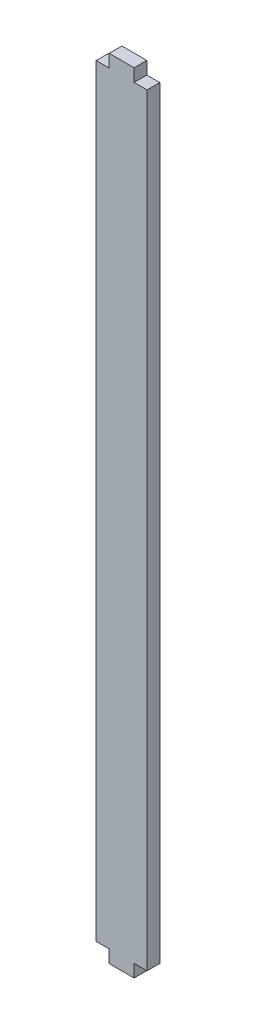
ISO-10303-21;
HEADER;
FILE_DESCRIPTION(('STEP AP214'),'2;1');
FILE_NAME('part.step','',(''),(''),'','','');
FILE_SCHEMA(('AUTOMOTIVE_DESIGN { 1 0 10303 214 1 1 1 1 }'));
ENDSEC;
DATA;
#1=APPLICATION_CONTEXT('core data for automotive mechanical design processes');
#2=APPLICATION_PROTOCOL_DEFINITION('international standard','automotive_design',2000,#1);
#3=PRODUCT_CONTEXT('',#1,'mechanical');
#4=PRODUCT('Part','Part','',(#3));
#5=PRODUCT_RELATED_PRODUCT_CATEGORY('part','',(#4));
#6=PRODUCT_DEFINITION_FORMATION('','',#4);
#7=PRODUCT_DEFINITION_CONTEXT('part definition',#1,'design');
#8=PRODUCT_DEFINITION('design','',#6,#7);
#9=PRODUCT_DEFINITION_SHAPE('','',#8);
#10=(LENGTH_UNIT() NAMED_UNIT(*) SI_UNIT(.MILLI.,.METRE.));
#11=(NAMED_UNIT(*) PLANE_ANGLE_UNIT() SI_UNIT($,.RADIAN.));
#12=(NAMED_UNIT(*) SI_UNIT($,.STERADIAN.) SOLID_ANGLE_UNIT());
#13=UNCERTAINTY_MEASURE_WITH_UNIT(LENGTH_MEASURE(1.E-05),#10,'distance_accuracy_value','');
#14=(GEOMETRIC_REPRESENTATION_CONTEXT(3) GLOBAL_UNCERTAINTY_ASSIGNED_CONTEXT((#13)) GLOBAL_UNIT_ASSIGNED_CONTEXT((#10,
#11,#12)) REPRESENTATION_CONTEXT('',''));
#15=CARTESIAN_POINT('',(0.,0.,0.));
#16=DIRECTION('',(0.,0.,1.));
#17=DIRECTION('',(1.,0.,0.));
#18=AXIS2_PLACEMENT_3D('',#15,#16,#17);
#19=CARTESIAN_POINT('',(112.4,-5.,69.9));
#20=DIRECTION('',(-1.,0.,0.));
#21=DIRECTION('',(0.,0.,1.));
#22=AXIS2_PLACEMENT_3D('',#19,#20,#21);
#23=PLANE('',#22);
#24=DIRECTION('',(0.,1.,0.));
#25=VECTOR('',#24,1.);
#26=CARTESIAN_POINT('',(112.4,-5.,64.9));
#27=LINE('',#26,#25);
#28=CARTESIAN_POINT('',(112.4,-5.,64.9));
#29=VERTEX_POINT('',#28);
#30=CARTESIAN_POINT('',(112.4,0.,64.9));
#31=VERTEX_POINT('',#30);
#32=EDGE_CURVE('E157',#29,#31,#27,.T.);
#33=ORIENTED_EDGE('',*,*,#32,.T.);
#34=DIRECTION('',(0.,0.,-1.));
#35=VECTOR('',#34,1.);
#36=CARTESIAN_POINT('',(112.4,0.,69.9));
#37=LINE('',#36,#35);
#38=CARTESIAN_POINT('',(112.4,0.,69.9));
#39=VERTEX_POINT('',#38);
#40=EDGE_CURVE('E11',#39,#31,#37,.T.);
#41=ORIENTED_EDGE('',*,*,#40,.F.);
#42=DIRECTION('',(0.,1.,0.));
#43=VECTOR('',#42,1.);
#44=CARTESIAN_POINT('',(112.4,-5.,69.9));
#45=LINE('',#44,#43);
#46=CARTESIAN_POINT('',(112.4,-5.,69.9));
#47=VERTEX_POINT('',#46);
#48=EDGE_CURVE('E180',#47,#39,#45,.T.);
#49=ORIENTED_EDGE('',*,*,#48,.F.);
#50=DIRECTION('',(0.,0.,-1.));
#51=VECTOR('',#50,1.);
#52=CARTESIAN_POINT('',(112.4,-5.,69.9));
#53=LINE('',#52,#51);
#54=EDGE_CURVE('E153',#47,#29,#53,.T.);
#55=ORIENTED_EDGE('',*,*,#54,.T.);
#56=EDGE_LOOP('',(#33,#41,#49,#55));
#57=FACE_BOUND('',#56,.T.);
#58=ADVANCED_FACE('F37',(#57),#23,.F.);
#59=CARTESIAN_POINT('',(112.4,0.,69.9));
#60=DIRECTION('',(0.,-1.,0.));
#61=DIRECTION('',(0.,0.,-1.));
#62=AXIS2_PLACEMENT_3D('',#59,#60,#61);
#63=PLANE('',#62);
#64=DIRECTION('',(-1.,0.,0.));
#65=VECTOR('',#64,1.);
#66=CARTESIAN_POINT('',(112.4,0.,64.9));
#67=LINE('',#66,#65);
#68=CARTESIAN_POINT('',(102.6,0.,64.9));
#69=VERTEX_POINT('',#68);
#70=EDGE_CURVE('E160',#31,#69,#67,.T.);
#71=ORIENTED_EDGE('',*,*,#70,.T.);
#72=DIRECTION('',(0.,0.,-1.));
#73=VECTOR('',#72,1.);
#74=CARTESIAN_POINT('',(102.6,0.,69.9));
#75=LINE('',#74,#73);
#76=CARTESIAN_POINT('',(102.6,0.,69.9));
#77=VERTEX_POINT('',#76);
#78=EDGE_CURVE('E45',#77,#69,#75,.T.);
#79=ORIENTED_EDGE('',*,*,#78,.F.);
#80=DIRECTION('',(-1.,0.,0.));
#81=VECTOR('',#80,1.);
#82=CARTESIAN_POINT('',(112.4,0.,69.9));
#83=LINE('',#82,#81);
#84=EDGE_CURVE('E108',#39,#77,#83,.T.);
#85=ORIENTED_EDGE('',*,*,#84,.F.);
#86=ORIENTED_EDGE('',*,*,#40,.T.);
#87=EDGE_LOOP('',(#71,#79,#85,#86));
#88=FACE_BOUND('',#87,.T.);
#89=ADVANCED_FACE('F259',(#88),#63,.F.);
#90=CARTESIAN_POINT('',(102.6,0.,69.9));
#91=DIRECTION('',(1.,0.,0.));
#92=DIRECTION('',(0.,0.,-1.));
#93=AXIS2_PLACEMENT_3D('',#90,#91,#92);
#94=PLANE('',#93);
#95=DIRECTION('',(0.,-1.,0.));
#96=VECTOR('',#95,1.);
#97=CARTESIAN_POINT('',(102.6,0.,64.9));
#98=LINE('',#97,#96);
#99=CARTESIAN_POINT('',(102.6,-5.,64.9));
#100=VERTEX_POINT('',#99);
#101=EDGE_CURVE('E162',#69,#100,#98,.T.);
#102=ORIENTED_EDGE('',*,*,#101,.T.);
#103=DIRECTION('',(0.,0.,-1.));
#104=VECTOR('',#103,1.);
#105=CARTESIAN_POINT('',(102.6,-5.,69.9));
#106=LINE('',#105,#104);
#107=CARTESIAN_POINT('',(102.6,-5.,69.9));
#108=VERTEX_POINT('',#107);
#109=EDGE_CURVE('E199',#108,#100,#106,.T.);
#110=ORIENTED_EDGE('',*,*,#109,.F.);
#111=DIRECTION('',(0.,-1.,0.));
#112=VECTOR('',#111,1.);
#113=CARTESIAN_POINT('',(102.6,0.,69.9));
#114=LINE('',#113,#112);
#115=EDGE_CURVE('E207',#77,#108,#114,.T.);
#116=ORIENTED_EDGE('',*,*,#115,.F.);
#117=ORIENTED_EDGE('',*,*,#78,.T.);
#118=EDGE_LOOP('',(#102,#110,#116,#117));
#119=FACE_BOUND('',#118,.T.);
#120=ADVANCED_FACE('F205',(#119),#94,.F.);
#121=CARTESIAN_POINT('',(102.6,-5.,69.9));
#122=DIRECTION('',(0.,-1.,0.));
#123=DIRECTION('',(0.,0.,-1.));
#124=AXIS2_PLACEMENT_3D('',#121,#122,#123);
#125=PLANE('',#124);
#126=DIRECTION('',(-1.,0.,0.));
#127=VECTOR('',#126,1.);
#128=CARTESIAN_POINT('',(102.6,-5.,64.9));
#129=LINE('',#128,#127);
#130=CARTESIAN_POINT('',(97.5,-5.,64.9));
#131=VERTEX_POINT('',#130);
#132=EDGE_CURVE('E164',#100,#131,#129,.T.);
#133=ORIENTED_EDGE('',*,*,#132,.T.);
#134=DIRECTION('',(0.,0.,-1.));
#135=VECTOR('',#134,1.);
#136=CARTESIAN_POINT('',(97.5,-5.,69.9));
#137=LINE('',#136,#135);
#138=CARTESIAN_POINT('',(97.5,-5.,69.9));
#139=VERTEX_POINT('',#138);
#140=EDGE_CURVE('E196',#139,#131,#137,.T.);
#141=ORIENTED_EDGE('',*,*,#140,.F.);
#142=DIRECTION('',(-1.,0.,0.));
#143=VECTOR('',#142,1.);
#144=CARTESIAN_POINT('',(102.6,-5.,69.9));
#145=LINE('',#144,#143);
#146=EDGE_CURVE('E226',#108,#139,#145,.T.);
#147=ORIENTED_EDGE('',*,*,#146,.F.);
#148=ORIENTED_EDGE('',*,*,#109,.T.);
#149=EDGE_LOOP('',(#133,#141,#147,#148));
#150=FACE_BOUND('',#149,.T.);
#151=ADVANCED_FACE('F216',(#150),#125,.F.);
#152=CARTESIAN_POINT('',(97.5,-5.,69.9));
#153=DIRECTION('',(1.,0.,0.));
#154=DIRECTION('',(0.,0.,-1.));
#155=AXIS2_PLACEMENT_3D('',#152,#153,#154);
#156=PLANE('',#155);
#157=DIRECTION('',(0.,-1.,0.));
#158=VECTOR('',#157,1.);
#159=CARTESIAN_POINT('',(97.5,-5.,64.9));
#160=LINE('',#159,#158);
#161=CARTESIAN_POINT('',(97.5,-305.,64.9));
#162=VERTEX_POINT('',#161);
#163=EDGE_CURVE('E166',#131,#162,#160,.T.);
#164=ORIENTED_EDGE('',*,*,#163,.T.);
#165=DIRECTION('',(0.,0.,-1.));
#166=VECTOR('',#165,1.);
#167=CARTESIAN_POINT('',(97.5,-305.,69.9));
#168=LINE('',#167,#166);
#169=CARTESIAN_POINT('',(97.5,-305.,69.9));
#170=VERTEX_POINT('',#169);
#171=EDGE_CURVE('E193',#170,#162,#168,.T.);
#172=ORIENTED_EDGE('',*,*,#171,.F.);
#173=DIRECTION('',(0.,-1.,0.));
#174=VECTOR('',#173,1.);
#175=CARTESIAN_POINT('',(97.5,-5.,69.9));
#176=LINE('',#175,#174);
#177=EDGE_CURVE('E222',#139,#170,#176,.T.);
#178=ORIENTED_EDGE('',*,*,#177,.F.);
#179=ORIENTED_EDGE('',*,*,#140,.T.);
#180=EDGE_LOOP('',(#164,#172,#178,#179));
#181=FACE_BOUND('',#180,.T.);
#182=ADVANCED_FACE('F220',(#181),#156,.F.);
#183=CARTESIAN_POINT('',(97.5,-305.,69.9));
#184=DIRECTION('',(0.,1.,0.));
#185=DIRECTION('',(0.,0.,1.));
#186=AXIS2_PLACEMENT_3D('',#183,#184,#185);
#187=PLANE('',#186);
#188=DIRECTION('',(1.,0.,0.));
#189=VECTOR('',#188,1.);
#190=CARTESIAN_POINT('',(97.5,-305.,64.9));
#191=LINE('',#190,#189);
#192=CARTESIAN_POINT('',(102.6,-305.,64.9));
#193=VERTEX_POINT('',#192);
#194=EDGE_CURVE('E169',#162,#193,#191,.T.);
#195=ORIENTED_EDGE('',*,*,#194,.T.);
#196=DIRECTION('',(0.,0.,-1.));
#197=VECTOR('',#196,1.);
#198=CARTESIAN_POINT('',(102.6,-305.,69.9));
#199=LINE('',#198,#197);
#200=CARTESIAN_POINT('',(102.6,-305.,69.9));
#201=VERTEX_POINT('',#200);
#202=EDGE_CURVE('E190',#201,#193,#199,.T.);
#203=ORIENTED_EDGE('',*,*,#202,.F.);
#204=DIRECTION('',(1.,0.,0.));
#205=VECTOR('',#204,1.);
#206=CARTESIAN_POINT('',(97.5,-305.,69.9));
#207=LINE('',#206,#205);
#208=EDGE_CURVE('E225',#170,#201,#207,.T.);
#209=ORIENTED_EDGE('',*,*,#208,.F.);
#210=ORIENTED_EDGE('',*,*,#171,.T.);
#211=EDGE_LOOP('',(#195,#203,#209,#210));
#212=FACE_BOUND('',#211,.T.);
#213=ADVANCED_FACE('F272',(#212),#187,.F.);
#214=CARTESIAN_POINT('',(102.6,-305.,69.9));
#215=DIRECTION('',(1.,0.,0.));
#216=DIRECTION('',(0.,0.,-1.));
#217=AXIS2_PLACEMENT_3D('',#214,#215,#216);
#218=PLANE('',#217);
#219=DIRECTION('',(0.,-1.,0.));
#220=VECTOR('',#219,1.);
#221=CARTESIAN_POINT('',(102.6,-305.,64.9));
#222=LINE('',#221,#220);
#223=CARTESIAN_POINT('',(102.6,-310.,64.9));
#224=VERTEX_POINT('',#223);
#225=EDGE_CURVE('E171',#193,#224,#222,.T.);
#226=ORIENTED_EDGE('',*,*,#225,.T.);
#227=DIRECTION('',(0.,0.,-1.));
#228=VECTOR('',#227,1.);
#229=CARTESIAN_POINT('',(102.6,-310.,69.9));
#230=LINE('',#229,#228);
#231=CARTESIAN_POINT('',(102.6,-310.,69.9));
#232=VERTEX_POINT('',#231);
#233=EDGE_CURVE('E187',#232,#224,#230,.T.);
#234=ORIENTED_EDGE('',*,*,#233,.F.);
#235=DIRECTION('',(0.,-1.,0.));
#236=VECTOR('',#235,1.);
#237=CARTESIAN_POINT('',(102.6,-305.,69.9));
#238=LINE('',#237,#236);
#239=EDGE_CURVE('E228',#201,#232,#238,.T.);
#240=ORIENTED_EDGE('',*,*,#239,.F.);
#241=ORIENTED_EDGE('',*,*,#202,.T.);
#242=EDGE_LOOP('',(#226,#234,#240,#241));
#243=FACE_BOUND('',#242,.T.);
#244=ADVANCED_FACE('F275',(#243),#218,.F.);
#245=CARTESIAN_POINT('',(102.6,-310.,69.9));
#246=DIRECTION('',(0.,1.,0.));
#247=DIRECTION('',(0.,0.,1.));
#248=AXIS2_PLACEMENT_3D('',#245,#246,#247);
#249=PLANE('',#248);
#250=DIRECTION('',(1.,0.,0.));
#251=VECTOR('',#250,1.);
#252=CARTESIAN_POINT('',(102.6,-310.,64.9));
#253=LINE('',#252,#251);
#254=CARTESIAN_POINT('',(112.4,-310.,64.9));
#255=VERTEX_POINT('',#254);
#256=EDGE_CURVE('E173',#224,#255,#253,.T.);
#257=ORIENTED_EDGE('',*,*,#256,.T.);
#258=DIRECTION('',(0.,0.,-1.));
#259=VECTOR('',#258,1.);
#260=CARTESIAN_POINT('',(112.4,-310.,69.9));
#261=LINE('',#260,#259);
#262=CARTESIAN_POINT('',(112.4,-310.,69.9));
#263=VERTEX_POINT('',#262);
#264=EDGE_CURVE('E184',#263,#255,#261,.T.);
#265=ORIENTED_EDGE('',*,*,#264,.F.);
#266=DIRECTION('',(1.,0.,0.));
#267=VECTOR('',#266,1.);
#268=CARTESIAN_POINT('',(102.6,-310.,69.9));
#269=LINE('',#268,#267);
#270=EDGE_CURVE('E234',#232,#263,#269,.T.);
#271=ORIENTED_EDGE('',*,*,#270,.F.);
#272=ORIENTED_EDGE('',*,*,#233,.T.);
#273=EDGE_LOOP('',(#257,#265,#271,#272));
#274=FACE_BOUND('',#273,.T.);
#275=ADVANCED_FACE('F240',(#274),#249,.F.);
#276=CARTESIAN_POINT('',(112.4,-310.,69.9));
#277=DIRECTION('',(-1.,0.,0.));
#278=DIRECTION('',(0.,0.,1.));
#279=AXIS2_PLACEMENT_3D('',#276,#277,#278);
#280=PLANE('',#279);
#281=DIRECTION('',(0.,1.,0.));
#282=VECTOR('',#281,1.);
#283=CARTESIAN_POINT('',(112.4,-310.,64.9));
#284=LINE('',#283,#282);
#285=CARTESIAN_POINT('',(112.4,-305.,64.9));
#286=VERTEX_POINT('',#285);
#287=EDGE_CURVE('E175',#255,#286,#284,.T.);
#288=ORIENTED_EDGE('',*,*,#287,.T.);
#289=DIRECTION('',(0.,0.,-1.));
#290=VECTOR('',#289,1.);
#291=CARTESIAN_POINT('',(112.4,-305.,69.9));
#292=LINE('',#291,#290);
#293=CARTESIAN_POINT('',(112.4,-305.,69.9));
#294=VERTEX_POINT('',#293);
#295=EDGE_CURVE('E148',#294,#286,#292,.T.);
#296=ORIENTED_EDGE('',*,*,#295,.F.);
#297=DIRECTION('',(0.,1.,0.));
#298=VECTOR('',#297,1.);
#299=CARTESIAN_POINT('',(112.4,-310.,69.9));
#300=LINE('',#299,#298);
#301=EDGE_CURVE('E139',#263,#294,#300,.T.);
#302=ORIENTED_EDGE('',*,*,#301,.F.);
#303=ORIENTED_EDGE('',*,*,#264,.T.);
#304=EDGE_LOOP('',(#288,#296,#302,#303));
#305=FACE_BOUND('',#304,.T.);
#306=ADVANCED_FACE('F244',(#305),#280,.F.);
#307=CARTESIAN_POINT('',(112.4,-305.,69.9));
#308=DIRECTION('',(0.,1.,0.));
#309=DIRECTION('',(0.,0.,1.));
#310=AXIS2_PLACEMENT_3D('',#307,#308,#309);
#311=PLANE('',#310);
#312=DIRECTION('',(1.,0.,0.));
#313=VECTOR('',#312,1.);
#314=CARTESIAN_POINT('',(112.4,-305.,64.9));
#315=LINE('',#314,#313);
#316=CARTESIAN_POINT('',(117.5,-305.,64.9));
#317=VERTEX_POINT('',#316);
#318=EDGE_CURVE('E147',#286,#317,#315,.T.);
#319=ORIENTED_EDGE('',*,*,#318,.T.);
#320=DIRECTION('',(0.,0.,-1.));
#321=VECTOR('',#320,1.);
#322=CARTESIAN_POINT('',(117.5,-305.,69.9));
#323=LINE('',#322,#321);
#324=CARTESIAN_POINT('',(117.5,-305.,69.9));
#325=VERTEX_POINT('',#324);
#326=EDGE_CURVE('E144',#325,#317,#323,.T.);
#327=ORIENTED_EDGE('',*,*,#326,.F.);
#328=DIRECTION('',(1.,0.,0.));
#329=VECTOR('',#328,1.);
#330=CARTESIAN_POINT('',(112.4,-305.,69.9));
#331=LINE('',#330,#329);
#332=EDGE_CURVE('E133',#294,#325,#331,.T.);
#333=ORIENTED_EDGE('',*,*,#332,.F.);
#334=ORIENTED_EDGE('',*,*,#295,.T.);
#335=EDGE_LOOP('',(#319,#327,#333,#334));
#336=FACE_BOUND('',#335,.T.);
#337=ADVANCED_FACE('F145',(#336),#311,.F.);
#338=CARTESIAN_POINT('',(117.5,-305.,69.9));
#339=DIRECTION('',(-1.,0.,0.));
#340=DIRECTION('',(0.,0.,1.));
#341=AXIS2_PLACEMENT_3D('',#338,#339,#340);
#342=PLANE('',#341);
#343=DIRECTION('',(0.,1.,0.));
#344=VECTOR('',#343,1.);
#345=CARTESIAN_POINT('',(117.5,-305.,64.9));
#346=LINE('',#345,#344);
#347=CARTESIAN_POINT('',(117.5,-5.,64.9));
#348=VERTEX_POINT('',#347);
#349=EDGE_CURVE('E94',#317,#348,#346,.T.);
#350=ORIENTED_EDGE('',*,*,#349,.T.);
#351=DIRECTION('',(0.,0.,-1.));
#352=VECTOR('',#351,1.);
#353=CARTESIAN_POINT('',(117.5,-5.,69.9));
#354=LINE('',#353,#352);
#355=CARTESIAN_POINT('',(117.5,-5.,69.9));
#356=VERTEX_POINT('',#355);
#357=EDGE_CURVE('E149',#356,#348,#354,.T.);
#358=ORIENTED_EDGE('',*,*,#357,.F.);
#359=DIRECTION('',(0.,1.,0.));
#360=VECTOR('',#359,1.);
#361=CARTESIAN_POINT('',(117.5,-305.,69.9));
#362=LINE('',#361,#360);
#363=EDGE_CURVE('E137',#325,#356,#362,.T.);
#364=ORIENTED_EDGE('',*,*,#363,.F.);
#365=ORIENTED_EDGE('',*,*,#326,.T.);
#366=EDGE_LOOP('',(#350,#358,#364,#365));
#367=FACE_BOUND('',#366,.T.);
#368=ADVANCED_FACE('F151',(#367),#342,.F.);
#369=CARTESIAN_POINT('',(117.5,-5.,69.9));
#370=DIRECTION('',(0.,-1.,0.));
#371=DIRECTION('',(0.,0.,-1.));
#372=AXIS2_PLACEMENT_3D('',#369,#370,#371);
#373=PLANE('',#372);
#374=DIRECTION('',(-1.,0.,0.));
#375=VECTOR('',#374,1.);
#376=CARTESIAN_POINT('',(117.5,-5.,64.9));
#377=LINE('',#376,#375);
#378=EDGE_CURVE('E100',#348,#29,#377,.T.);
#379=ORIENTED_EDGE('',*,*,#378,.T.);
#380=ORIENTED_EDGE('',*,*,#54,.F.);
#381=DIRECTION('',(-1.,0.,0.));
#382=VECTOR('',#381,1.);
#383=CARTESIAN_POINT('',(117.5,-5.,69.9));
#384=LINE('',#383,#382);
#385=EDGE_CURVE('E53',#356,#47,#384,.T.);
#386=ORIENTED_EDGE('',*,*,#385,.F.);
#387=ORIENTED_EDGE('',*,*,#357,.T.);
#388=EDGE_LOOP('',(#379,#380,#386,#387));
#389=FACE_BOUND('',#388,.T.);
#390=ADVANCED_FACE('F248',(#389),#373,.F.);
#391=CARTESIAN_POINT('',(0.,0.,69.9));
#392=DIRECTION('',(0.,0.,1.));
#393=DIRECTION('',(1.,0.,0.));
#394=AXIS2_PLACEMENT_3D('',#391,#392,#393);
#395=PLANE('',#394);
#396=ORIENTED_EDGE('',*,*,#48,.T.);
#397=ORIENTED_EDGE('',*,*,#84,.T.);
#398=ORIENTED_EDGE('',*,*,#115,.T.);
#399=ORIENTED_EDGE('',*,*,#146,.T.);
#400=ORIENTED_EDGE('',*,*,#177,.T.);
#401=ORIENTED_EDGE('',*,*,#208,.T.);
#402=ORIENTED_EDGE('',*,*,#239,.T.);
#403=ORIENTED_EDGE('',*,*,#270,.T.);
#404=ORIENTED_EDGE('',*,*,#301,.T.);
#405=ORIENTED_EDGE('',*,*,#332,.T.);
#406=ORIENTED_EDGE('',*,*,#363,.T.);
#407=ORIENTED_EDGE('',*,*,#385,.T.);
#408=EDGE_LOOP('',(#396,#397,#398,#399,#400,#401,#402,#403,#404,#405,#406,#407));
#409=FACE_BOUND('',#408,.T.);
#410=ADVANCED_FACE('F135',(#409),#395,.T.);
#411=CARTESIAN_POINT('',(0.,0.,64.9));
#412=DIRECTION('',(0.,0.,1.));
#413=DIRECTION('',(1.,0.,0.));
#414=AXIS2_PLACEMENT_3D('',#411,#412,#413);
#415=PLANE('',#414);
#416=ORIENTED_EDGE('',*,*,#32,.F.);
#417=ORIENTED_EDGE('',*,*,#378,.F.);
#418=ORIENTED_EDGE('',*,*,#349,.F.);
#419=ORIENTED_EDGE('',*,*,#318,.F.);
#420=ORIENTED_EDGE('',*,*,#287,.F.);
#421=ORIENTED_EDGE('',*,*,#256,.F.);
#422=ORIENTED_EDGE('',*,*,#225,.F.);
#423=ORIENTED_EDGE('',*,*,#194,.F.);
#424=ORIENTED_EDGE('',*,*,#163,.F.);
#425=ORIENTED_EDGE('',*,*,#132,.F.);
#426=ORIENTED_EDGE('',*,*,#101,.F.);
#427=ORIENTED_EDGE('',*,*,#70,.F.);
#428=EDGE_LOOP('',(#416,#417,#418,#419,#420,#421,#422,#423,#424,#425,#426,#427));
#429=FACE_BOUND('',#428,.T.);
#430=ADVANCED_FACE('F211',(#429),#415,.F.);
#431=CLOSED_SHELL('',(#58,#89,#120,#151,#182,#213,#244,#275,#306,#337,#368,#390,#410,#430));
#432=MANIFOLD_SOLID_BREP('B2',#431);
#433=ADVANCED_BREP_SHAPE_REPRESENTATION('',(#18,#432),#14);
#434=SHAPE_DEFINITION_REPRESENTATION(#9,#433);
ENDSEC;
END-ISO-10303-21;
